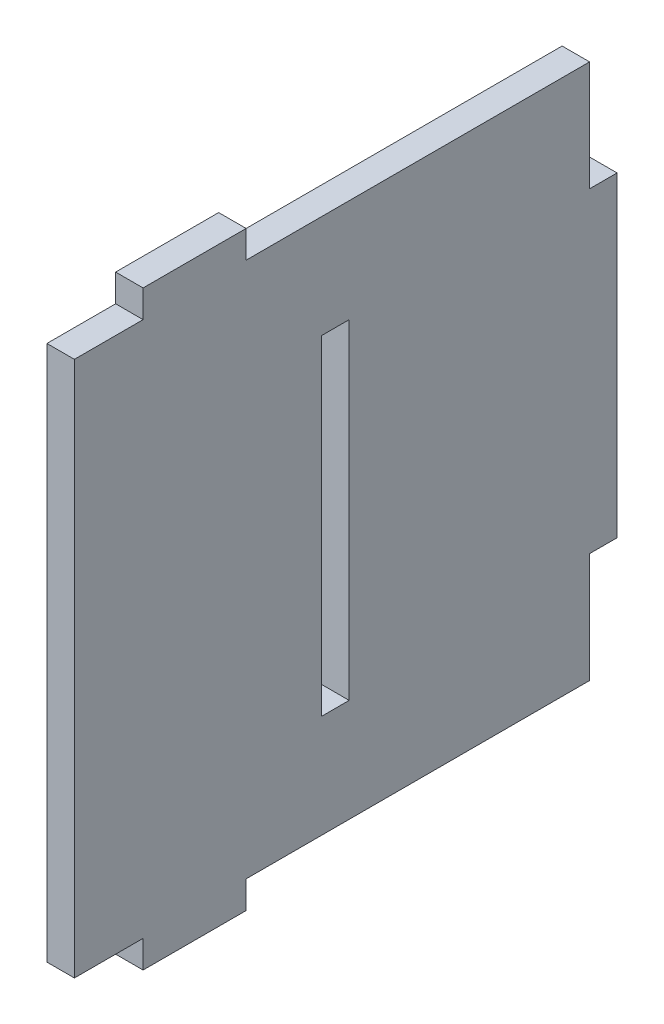
ISO-10303-21;
HEADER;
FILE_DESCRIPTION(('STEP AP214'),'2;1');
FILE_NAME('part.step','',(''),(''),'','','');
FILE_SCHEMA(('AUTOMOTIVE_DESIGN { 1 0 10303 214 1 1 1 1 }'));
ENDSEC;
DATA;
#1=APPLICATION_CONTEXT('core data for automotive mechanical design processes');
#2=APPLICATION_PROTOCOL_DEFINITION('international standard','automotive_design',2000,#1);
#3=PRODUCT_CONTEXT('',#1,'mechanical');
#4=PRODUCT('Part','Part','',(#3));
#5=PRODUCT_RELATED_PRODUCT_CATEGORY('part','',(#4));
#6=PRODUCT_DEFINITION_FORMATION('','',#4);
#7=PRODUCT_DEFINITION_CONTEXT('part definition',#1,'design');
#8=PRODUCT_DEFINITION('design','',#6,#7);
#9=PRODUCT_DEFINITION_SHAPE('','',#8);
#10=(LENGTH_UNIT() NAMED_UNIT(*) SI_UNIT(.MILLI.,.METRE.));
#11=(NAMED_UNIT(*) PLANE_ANGLE_UNIT() SI_UNIT($,.RADIAN.));
#12=(NAMED_UNIT(*) SI_UNIT($,.STERADIAN.) SOLID_ANGLE_UNIT());
#13=UNCERTAINTY_MEASURE_WITH_UNIT(LENGTH_MEASURE(1.E-05),#10,'distance_accuracy_value','');
#14=(GEOMETRIC_REPRESENTATION_CONTEXT(3) GLOBAL_UNCERTAINTY_ASSIGNED_CONTEXT((#13)) GLOBAL_UNIT_ASSIGNED_CONTEXT((#10,
#11,#12)) REPRESENTATION_CONTEXT('',''));
#15=CARTESIAN_POINT('',(0.,0.,0.));
#16=DIRECTION('',(0.,0.,1.));
#17=DIRECTION('',(1.,0.,0.));
#18=AXIS2_PLACEMENT_3D('',#15,#16,#17);
#19=CARTESIAN_POINT('',(4.,0.,0.));
#20=DIRECTION('',(-1.,0.,0.));
#21=DIRECTION('',(0.,0.,1.));
#22=AXIS2_PLACEMENT_3D('',#19,#20,#21);
#23=PLANE('',#22);
#24=DIRECTION('',(0.,-1.,0.));
#25=VECTOR('',#24,1.);
#26=CARTESIAN_POINT('',(4.,0.,0.));
#27=LINE('',#26,#25);
#28=CARTESIAN_POINT('',(4.,78.,0.));
#29=VERTEX_POINT('',#28);
#30=CARTESIAN_POINT('',(4.,0.,0.));
#31=VERTEX_POINT('',#30);
#32=EDGE_CURVE('E205',#29,#31,#27,.T.);
#33=ORIENTED_EDGE('',*,*,#32,.T.);
#34=DIRECTION('',(0.,0.,-1.));
#35=VECTOR('',#34,1.);
#36=CARTESIAN_POINT('',(4.,0.,0.));
#37=LINE('',#36,#35);
#38=CARTESIAN_POINT('',(4.,0.,-10.));
#39=VERTEX_POINT('',#38);
#40=EDGE_CURVE('E208',#31,#39,#37,.T.);
#41=ORIENTED_EDGE('',*,*,#40,.T.);
#42=DIRECTION('',(0.,-1.,0.));
#43=VECTOR('',#42,1.);
#44=CARTESIAN_POINT('',(4.,0.,-10.));
#45=LINE('',#44,#43);
#46=CARTESIAN_POINT('',(4.,-4.,-10.));
#47=VERTEX_POINT('',#46);
#48=EDGE_CURVE('E211',#39,#47,#45,.T.);
#49=ORIENTED_EDGE('',*,*,#48,.T.);
#50=DIRECTION('',(0.,0.,-1.));
#51=VECTOR('',#50,1.);
#52=CARTESIAN_POINT('',(4.,-4.,-10.));
#53=LINE('',#52,#51);
#54=CARTESIAN_POINT('',(4.,-4.,-25.));
#55=VERTEX_POINT('',#54);
#56=EDGE_CURVE('E213',#47,#55,#53,.T.);
#57=ORIENTED_EDGE('',*,*,#56,.T.);
#58=DIRECTION('',(0.,1.,0.));
#59=VECTOR('',#58,1.);
#60=CARTESIAN_POINT('',(4.,-4.,-25.));
#61=LINE('',#60,#59);
#62=CARTESIAN_POINT('',(4.,0.,-25.));
#63=VERTEX_POINT('',#62);
#64=EDGE_CURVE('E215',#55,#63,#61,.T.);
#65=ORIENTED_EDGE('',*,*,#64,.T.);
#66=DIRECTION('',(0.,0.,-1.));
#67=VECTOR('',#66,1.);
#68=CARTESIAN_POINT('',(4.,0.,-25.));
#69=LINE('',#68,#67);
#70=CARTESIAN_POINT('',(4.,0.,-75.));
#71=VERTEX_POINT('',#70);
#72=EDGE_CURVE('E217',#63,#71,#69,.T.);
#73=ORIENTED_EDGE('',*,*,#72,.T.);
#74=DIRECTION('',(0.,1.,0.));
#75=VECTOR('',#74,1.);
#76=CARTESIAN_POINT('',(4.,0.,-75.));
#77=LINE('',#76,#75);
#78=CARTESIAN_POINT('',(4.,16.,-75.));
#79=VERTEX_POINT('',#78);
#80=EDGE_CURVE('E219',#71,#79,#77,.T.);
#81=ORIENTED_EDGE('',*,*,#80,.T.);
#82=DIRECTION('',(0.,0.,-1.));
#83=VECTOR('',#82,1.);
#84=CARTESIAN_POINT('',(4.,16.,-75.));
#85=LINE('',#84,#83);
#86=CARTESIAN_POINT('',(4.,16.,-79.));
#87=VERTEX_POINT('',#86);
#88=EDGE_CURVE('E221',#79,#87,#85,.T.);
#89=ORIENTED_EDGE('',*,*,#88,.T.);
#90=DIRECTION('',(0.,1.,0.));
#91=VECTOR('',#90,1.);
#92=CARTESIAN_POINT('',(4.,62.,-79.));
#93=LINE('',#92,#91);
#94=CARTESIAN_POINT('',(4.,62.,-79.));
#95=VERTEX_POINT('',#94);
#96=EDGE_CURVE('E223',#87,#95,#93,.T.);
#97=ORIENTED_EDGE('',*,*,#96,.T.);
#98=DIRECTION('',(0.,0.,1.));
#99=VECTOR('',#98,1.);
#100=CARTESIAN_POINT('',(4.,62.,-75.));
#101=LINE('',#100,#99);
#102=CARTESIAN_POINT('',(4.,62.,-75.));
#103=VERTEX_POINT('',#102);
#104=EDGE_CURVE('E225',#95,#103,#101,.T.);
#105=ORIENTED_EDGE('',*,*,#104,.T.);
#106=DIRECTION('',(0.,1.,0.));
#107=VECTOR('',#106,1.);
#108=CARTESIAN_POINT('',(4.,62.,-75.));
#109=LINE('',#108,#107);
#110=CARTESIAN_POINT('',(4.,78.,-75.));
#111=VERTEX_POINT('',#110);
#112=EDGE_CURVE('E227',#103,#111,#109,.T.);
#113=ORIENTED_EDGE('',*,*,#112,.T.);
#114=DIRECTION('',(0.,0.,1.));
#115=VECTOR('',#114,1.);
#116=CARTESIAN_POINT('',(4.,78.,-25.));
#117=LINE('',#116,#115);
#118=CARTESIAN_POINT('',(4.,78.,-25.));
#119=VERTEX_POINT('',#118);
#120=EDGE_CURVE('E229',#111,#119,#117,.T.);
#121=ORIENTED_EDGE('',*,*,#120,.T.);
#122=DIRECTION('',(0.,1.,0.));
#123=VECTOR('',#122,1.);
#124=CARTESIAN_POINT('',(4.,82.,-25.));
#125=LINE('',#124,#123);
#126=CARTESIAN_POINT('',(4.,82.,-25.));
#127=VERTEX_POINT('',#126);
#128=EDGE_CURVE('E231',#119,#127,#125,.T.);
#129=ORIENTED_EDGE('',*,*,#128,.T.);
#130=DIRECTION('',(0.,0.,1.));
#131=VECTOR('',#130,1.);
#132=CARTESIAN_POINT('',(4.,82.,-10.));
#133=LINE('',#132,#131);
#134=CARTESIAN_POINT('',(4.,82.,-10.));
#135=VERTEX_POINT('',#134);
#136=EDGE_CURVE('E233',#127,#135,#133,.T.);
#137=ORIENTED_EDGE('',*,*,#136,.T.);
#138=DIRECTION('',(0.,-1.,0.));
#139=VECTOR('',#138,1.);
#140=CARTESIAN_POINT('',(4.,78.,-10.));
#141=LINE('',#140,#139);
#142=CARTESIAN_POINT('',(4.,78.,-10.));
#143=VERTEX_POINT('',#142);
#144=EDGE_CURVE('E235',#135,#143,#141,.T.);
#145=ORIENTED_EDGE('',*,*,#144,.T.);
#146=DIRECTION('',(0.,0.,1.));
#147=VECTOR('',#146,1.);
#148=CARTESIAN_POINT('',(4.,78.,0.));
#149=LINE('',#148,#147);
#150=EDGE_CURVE('E237',#143,#29,#149,.T.);
#151=ORIENTED_EDGE('',*,*,#150,.T.);
#152=EDGE_LOOP('',(#33,#41,#49,#57,#65,#73,#81,#89,#97,#105,#113,#121,#129,#137,#145,#151));
#153=FACE_BOUND('',#152,.T.);
#154=DIRECTION('',(0.,-1.,0.));
#155=VECTOR('',#154,1.);
#156=CARTESIAN_POINT('',(4.,15.,-36.));
#157=LINE('',#156,#155);
#158=CARTESIAN_POINT('',(4.,63.,-36.));
#159=VERTEX_POINT('',#158);
#160=CARTESIAN_POINT('',(4.,15.,-36.));
#161=VERTEX_POINT('',#160);
#162=EDGE_CURVE('E169',#159,#161,#157,.T.);
#163=ORIENTED_EDGE('',*,*,#162,.F.);
#164=DIRECTION('',(0.,0.,1.));
#165=VECTOR('',#164,1.);
#166=CARTESIAN_POINT('',(4.,63.,-36.));
#167=LINE('',#166,#165);
#168=CARTESIAN_POINT('',(4.,63.,-40.));
#169=VERTEX_POINT('',#168);
#170=EDGE_CURVE('E191',#169,#159,#167,.T.);
#171=ORIENTED_EDGE('',*,*,#170,.F.);
#172=DIRECTION('',(0.,1.,0.));
#173=VECTOR('',#172,1.);
#174=CARTESIAN_POINT('',(4.,15.,-40.));
#175=LINE('',#174,#173);
#176=CARTESIAN_POINT('',(4.,15.,-40.));
#177=VERTEX_POINT('',#176);
#178=EDGE_CURVE('E189',#177,#169,#175,.T.);
#179=ORIENTED_EDGE('',*,*,#178,.F.);
#180=DIRECTION('',(0.,0.,-1.));
#181=VECTOR('',#180,1.);
#182=CARTESIAN_POINT('',(4.,15.,-36.));
#183=LINE('',#182,#181);
#184=EDGE_CURVE('E177',#161,#177,#183,.T.);
#185=ORIENTED_EDGE('',*,*,#184,.F.);
#186=EDGE_LOOP('',(#163,#171,#179,#185));
#187=FACE_BOUND('',#186,.T.);
#188=ADVANCED_FACE('F32',(#153,#187),#23,.F.);
#189=CARTESIAN_POINT('',(0.,0.,0.));
#190=DIRECTION('',(-1.,0.,0.));
#191=DIRECTION('',(0.,0.,1.));
#192=AXIS2_PLACEMENT_3D('',#189,#190,#191);
#193=PLANE('',#192);
#194=DIRECTION('',(0.,-1.,0.));
#195=VECTOR('',#194,1.);
#196=CARTESIAN_POINT('',(0.,0.,0.));
#197=LINE('',#196,#195);
#198=CARTESIAN_POINT('',(0.,78.,0.));
#199=VERTEX_POINT('',#198);
#200=CARTESIAN_POINT('',(0.,0.,0.));
#201=VERTEX_POINT('',#200);
#202=EDGE_CURVE('E185',#199,#201,#197,.T.);
#203=ORIENTED_EDGE('',*,*,#202,.F.);
#204=DIRECTION('',(0.,0.,1.));
#205=VECTOR('',#204,1.);
#206=CARTESIAN_POINT('',(0.,78.,0.));
#207=LINE('',#206,#205);
#208=CARTESIAN_POINT('',(0.,78.,-10.));
#209=VERTEX_POINT('',#208);
#210=EDGE_CURVE('E209',#209,#199,#207,.T.);
#211=ORIENTED_EDGE('',*,*,#210,.F.);
#212=DIRECTION('',(0.,-1.,0.));
#213=VECTOR('',#212,1.);
#214=CARTESIAN_POINT('',(0.,78.,-10.));
#215=LINE('',#214,#213);
#216=CARTESIAN_POINT('',(0.,82.,-10.));
#217=VERTEX_POINT('',#216);
#218=EDGE_CURVE('E268',#217,#209,#215,.T.);
#219=ORIENTED_EDGE('',*,*,#218,.F.);
#220=DIRECTION('',(0.,0.,1.));
#221=VECTOR('',#220,1.);
#222=CARTESIAN_POINT('',(0.,82.,-10.));
#223=LINE('',#222,#221);
#224=CARTESIAN_POINT('',(0.,82.,-25.));
#225=VERTEX_POINT('',#224);
#226=EDGE_CURVE('E266',#225,#217,#223,.T.);
#227=ORIENTED_EDGE('',*,*,#226,.F.);
#228=DIRECTION('',(0.,1.,0.));
#229=VECTOR('',#228,1.);
#230=CARTESIAN_POINT('',(0.,82.,-25.));
#231=LINE('',#230,#229);
#232=CARTESIAN_POINT('',(0.,78.,-25.));
#233=VERTEX_POINT('',#232);
#234=EDGE_CURVE('E264',#233,#225,#231,.T.);
#235=ORIENTED_EDGE('',*,*,#234,.F.);
#236=DIRECTION('',(0.,0.,1.));
#237=VECTOR('',#236,1.);
#238=CARTESIAN_POINT('',(0.,78.,-25.));
#239=LINE('',#238,#237);
#240=CARTESIAN_POINT('',(0.,78.,-75.));
#241=VERTEX_POINT('',#240);
#242=EDGE_CURVE('E262',#241,#233,#239,.T.);
#243=ORIENTED_EDGE('',*,*,#242,.F.);
#244=DIRECTION('',(0.,1.,0.));
#245=VECTOR('',#244,1.);
#246=CARTESIAN_POINT('',(0.,62.,-75.));
#247=LINE('',#246,#245);
#248=CARTESIAN_POINT('',(0.,62.,-75.));
#249=VERTEX_POINT('',#248);
#250=EDGE_CURVE('E260',#249,#241,#247,.T.);
#251=ORIENTED_EDGE('',*,*,#250,.F.);
#252=DIRECTION('',(0.,0.,1.));
#253=VECTOR('',#252,1.);
#254=CARTESIAN_POINT('',(0.,62.,-75.));
#255=LINE('',#254,#253);
#256=CARTESIAN_POINT('',(0.,62.,-79.));
#257=VERTEX_POINT('',#256);
#258=EDGE_CURVE('E258',#257,#249,#255,.T.);
#259=ORIENTED_EDGE('',*,*,#258,.F.);
#260=DIRECTION('',(0.,1.,0.));
#261=VECTOR('',#260,1.);
#262=CARTESIAN_POINT('',(0.,62.,-79.));
#263=LINE('',#262,#261);
#264=CARTESIAN_POINT('',(0.,16.,-79.));
#265=VERTEX_POINT('',#264);
#266=EDGE_CURVE('E256',#265,#257,#263,.T.);
#267=ORIENTED_EDGE('',*,*,#266,.F.);
#268=DIRECTION('',(0.,0.,-1.));
#269=VECTOR('',#268,1.);
#270=CARTESIAN_POINT('',(0.,16.,-75.));
#271=LINE('',#270,#269);
#272=CARTESIAN_POINT('',(0.,16.,-75.));
#273=VERTEX_POINT('',#272);
#274=EDGE_CURVE('E254',#273,#265,#271,.T.);
#275=ORIENTED_EDGE('',*,*,#274,.F.);
#276=DIRECTION('',(0.,1.,0.));
#277=VECTOR('',#276,1.);
#278=CARTESIAN_POINT('',(0.,0.,-75.));
#279=LINE('',#278,#277);
#280=CARTESIAN_POINT('',(0.,0.,-75.));
#281=VERTEX_POINT('',#280);
#282=EDGE_CURVE('E252',#281,#273,#279,.T.);
#283=ORIENTED_EDGE('',*,*,#282,.F.);
#284=DIRECTION('',(0.,0.,-1.));
#285=VECTOR('',#284,1.);
#286=CARTESIAN_POINT('',(0.,0.,-25.));
#287=LINE('',#286,#285);
#288=CARTESIAN_POINT('',(0.,0.,-25.));
#289=VERTEX_POINT('',#288);
#290=EDGE_CURVE('E250',#289,#281,#287,.T.);
#291=ORIENTED_EDGE('',*,*,#290,.F.);
#292=DIRECTION('',(0.,1.,0.));
#293=VECTOR('',#292,1.);
#294=CARTESIAN_POINT('',(0.,-4.,-25.));
#295=LINE('',#294,#293);
#296=CARTESIAN_POINT('',(0.,-4.,-25.));
#297=VERTEX_POINT('',#296);
#298=EDGE_CURVE('E248',#297,#289,#295,.T.);
#299=ORIENTED_EDGE('',*,*,#298,.F.);
#300=DIRECTION('',(0.,0.,-1.));
#301=VECTOR('',#300,1.);
#302=CARTESIAN_POINT('',(0.,-4.,-10.));
#303=LINE('',#302,#301);
#304=CARTESIAN_POINT('',(0.,-4.,-10.));
#305=VERTEX_POINT('',#304);
#306=EDGE_CURVE('E246',#305,#297,#303,.T.);
#307=ORIENTED_EDGE('',*,*,#306,.F.);
#308=DIRECTION('',(0.,-1.,0.));
#309=VECTOR('',#308,1.);
#310=CARTESIAN_POINT('',(0.,0.,-10.));
#311=LINE('',#310,#309);
#312=CARTESIAN_POINT('',(0.,0.,-10.));
#313=VERTEX_POINT('',#312);
#314=EDGE_CURVE('E244',#313,#305,#311,.T.);
#315=ORIENTED_EDGE('',*,*,#314,.F.);
#316=DIRECTION('',(0.,0.,-1.));
#317=VECTOR('',#316,1.);
#318=CARTESIAN_POINT('',(0.,0.,0.));
#319=LINE('',#318,#317);
#320=EDGE_CURVE('E242',#201,#313,#319,.T.);
#321=ORIENTED_EDGE('',*,*,#320,.F.);
#322=EDGE_LOOP('',(#203,#211,#219,#227,#235,#243,#251,#259,#267,#275,#283,#291,#299,#307,#315,#321));
#323=FACE_BOUND('',#322,.T.);
#324=DIRECTION('',(0.,0.,1.));
#325=VECTOR('',#324,1.);
#326=CARTESIAN_POINT('',(0.,63.,-36.));
#327=LINE('',#326,#325);
#328=CARTESIAN_POINT('',(0.,63.,-40.));
#329=VERTEX_POINT('',#328);
#330=CARTESIAN_POINT('',(0.,63.,-36.));
#331=VERTEX_POINT('',#330);
#332=EDGE_CURVE('E178',#329,#331,#327,.T.);
#333=ORIENTED_EDGE('',*,*,#332,.T.);
#334=DIRECTION('',(0.,-1.,0.));
#335=VECTOR('',#334,1.);
#336=CARTESIAN_POINT('',(0.,15.,-36.));
#337=LINE('',#336,#335);
#338=CARTESIAN_POINT('',(0.,15.,-36.));
#339=VERTEX_POINT('',#338);
#340=EDGE_CURVE('E55',#331,#339,#337,.T.);
#341=ORIENTED_EDGE('',*,*,#340,.T.);
#342=DIRECTION('',(0.,0.,-1.));
#343=VECTOR('',#342,1.);
#344=CARTESIAN_POINT('',(0.,15.,-36.));
#345=LINE('',#344,#343);
#346=CARTESIAN_POINT('',(0.,15.,-40.));
#347=VERTEX_POINT('',#346);
#348=EDGE_CURVE('E184',#339,#347,#345,.T.);
#349=ORIENTED_EDGE('',*,*,#348,.T.);
#350=DIRECTION('',(0.,1.,0.));
#351=VECTOR('',#350,1.);
#352=CARTESIAN_POINT('',(0.,15.,-40.));
#353=LINE('',#352,#351);
#354=EDGE_CURVE('E197',#347,#329,#353,.T.);
#355=ORIENTED_EDGE('',*,*,#354,.T.);
#356=EDGE_LOOP('',(#333,#341,#349,#355));
#357=FACE_BOUND('',#356,.T.);
#358=ADVANCED_FACE('F322',(#323,#357),#193,.T.);
#359=CARTESIAN_POINT('',(4.,0.,0.));
#360=DIRECTION('',(0.,0.,-1.));
#361=DIRECTION('',(-1.,0.,0.));
#362=AXIS2_PLACEMENT_3D('',#359,#360,#361);
#363=PLANE('',#362);
#364=ORIENTED_EDGE('',*,*,#202,.T.);
#365=DIRECTION('',(-1.,0.,0.));
#366=VECTOR('',#365,1.);
#367=CARTESIAN_POINT('',(4.,0.,0.));
#368=LINE('',#367,#366);
#369=EDGE_CURVE('E11',#31,#201,#368,.T.);
#370=ORIENTED_EDGE('',*,*,#369,.F.);
#371=ORIENTED_EDGE('',*,*,#32,.F.);
#372=DIRECTION('',(-1.,0.,0.));
#373=VECTOR('',#372,1.);
#374=CARTESIAN_POINT('',(4.,78.,0.));
#375=LINE('',#374,#373);
#376=EDGE_CURVE('E239',#29,#199,#375,.T.);
#377=ORIENTED_EDGE('',*,*,#376,.T.);
#378=EDGE_LOOP('',(#364,#370,#371,#377));
#379=FACE_BOUND('',#378,.T.);
#380=ADVANCED_FACE('F34',(#379),#363,.F.);
#381=CARTESIAN_POINT('',(4.,0.,0.));
#382=DIRECTION('',(0.,1.,0.));
#383=DIRECTION('',(0.,0.,1.));
#384=AXIS2_PLACEMENT_3D('',#381,#382,#383);
#385=PLANE('',#384);
#386=ORIENTED_EDGE('',*,*,#320,.T.);
#387=DIRECTION('',(-1.,0.,0.));
#388=VECTOR('',#387,1.);
#389=CARTESIAN_POINT('',(4.,0.,-10.));
#390=LINE('',#389,#388);
#391=EDGE_CURVE('E40',#39,#313,#390,.T.);
#392=ORIENTED_EDGE('',*,*,#391,.F.);
#393=ORIENTED_EDGE('',*,*,#40,.F.);
#394=ORIENTED_EDGE('',*,*,#369,.T.);
#395=EDGE_LOOP('',(#386,#392,#393,#394));
#396=FACE_BOUND('',#395,.T.);
#397=ADVANCED_FACE('F339',(#396),#385,.F.);
#398=CARTESIAN_POINT('',(4.,0.,-10.));
#399=DIRECTION('',(0.,0.,-1.));
#400=DIRECTION('',(0.,1.,0.));
#401=AXIS2_PLACEMENT_3D('',#398,#399,#400);
#402=PLANE('',#401);
#403=ORIENTED_EDGE('',*,*,#314,.T.);
#404=DIRECTION('',(-1.,0.,0.));
#405=VECTOR('',#404,1.);
#406=CARTESIAN_POINT('',(4.,-4.,-10.));
#407=LINE('',#406,#405);
#408=EDGE_CURVE('E309',#47,#305,#407,.T.);
#409=ORIENTED_EDGE('',*,*,#408,.F.);
#410=ORIENTED_EDGE('',*,*,#48,.F.);
#411=ORIENTED_EDGE('',*,*,#391,.T.);
#412=EDGE_LOOP('',(#403,#409,#410,#411));
#413=FACE_BOUND('',#412,.T.);
#414=ADVANCED_FACE('F316',(#413),#402,.F.);
#415=CARTESIAN_POINT('',(4.,-4.,-10.));
#416=DIRECTION('',(0.,1.,0.));
#417=DIRECTION('',(0.,0.,1.));
#418=AXIS2_PLACEMENT_3D('',#415,#416,#417);
#419=PLANE('',#418);
#420=ORIENTED_EDGE('',*,*,#306,.T.);
#421=DIRECTION('',(-1.,0.,0.));
#422=VECTOR('',#421,1.);
#423=CARTESIAN_POINT('',(4.,-4.,-25.));
#424=LINE('',#423,#422);
#425=EDGE_CURVE('E306',#55,#297,#424,.T.);
#426=ORIENTED_EDGE('',*,*,#425,.F.);
#427=ORIENTED_EDGE('',*,*,#56,.F.);
#428=ORIENTED_EDGE('',*,*,#408,.T.);
#429=EDGE_LOOP('',(#420,#426,#427,#428));
#430=FACE_BOUND('',#429,.T.);
#431=ADVANCED_FACE('F328',(#430),#419,.F.);
#432=CARTESIAN_POINT('',(4.,-4.,-25.));
#433=DIRECTION('',(0.,0.,1.));
#434=DIRECTION('',(0.,-1.,0.));
#435=AXIS2_PLACEMENT_3D('',#432,#433,#434);
#436=PLANE('',#435);
#437=ORIENTED_EDGE('',*,*,#298,.T.);
#438=DIRECTION('',(-1.,0.,0.));
#439=VECTOR('',#438,1.);
#440=CARTESIAN_POINT('',(4.,0.,-25.));
#441=LINE('',#440,#439);
#442=EDGE_CURVE('E303',#63,#289,#441,.T.);
#443=ORIENTED_EDGE('',*,*,#442,.F.);
#444=ORIENTED_EDGE('',*,*,#64,.F.);
#445=ORIENTED_EDGE('',*,*,#425,.T.);
#446=EDGE_LOOP('',(#437,#443,#444,#445));
#447=FACE_BOUND('',#446,.T.);
#448=ADVANCED_FACE('F332',(#447),#436,.F.);
#449=CARTESIAN_POINT('',(4.,0.,-25.));
#450=DIRECTION('',(0.,1.,0.));
#451=DIRECTION('',(0.,0.,1.));
#452=AXIS2_PLACEMENT_3D('',#449,#450,#451);
#453=PLANE('',#452);
#454=ORIENTED_EDGE('',*,*,#290,.T.);
#455=DIRECTION('',(-1.,0.,0.));
#456=VECTOR('',#455,1.);
#457=CARTESIAN_POINT('',(4.,0.,-75.));
#458=LINE('',#457,#456);
#459=EDGE_CURVE('E300',#71,#281,#458,.T.);
#460=ORIENTED_EDGE('',*,*,#459,.F.);
#461=ORIENTED_EDGE('',*,*,#72,.F.);
#462=ORIENTED_EDGE('',*,*,#442,.T.);
#463=EDGE_LOOP('',(#454,#460,#461,#462));
#464=FACE_BOUND('',#463,.T.);
#465=ADVANCED_FACE('F392',(#464),#453,.F.);
#466=CARTESIAN_POINT('',(4.,0.,-75.));
#467=DIRECTION('',(0.,0.,1.));
#468=DIRECTION('',(1.,0.,0.));
#469=AXIS2_PLACEMENT_3D('',#466,#467,#468);
#470=PLANE('',#469);
#471=ORIENTED_EDGE('',*,*,#282,.T.);
#472=DIRECTION('',(-1.,0.,0.));
#473=VECTOR('',#472,1.);
#474=CARTESIAN_POINT('',(4.,16.,-75.));
#475=LINE('',#474,#473);
#476=EDGE_CURVE('E297',#79,#273,#475,.T.);
#477=ORIENTED_EDGE('',*,*,#476,.F.);
#478=ORIENTED_EDGE('',*,*,#80,.F.);
#479=ORIENTED_EDGE('',*,*,#459,.T.);
#480=EDGE_LOOP('',(#471,#477,#478,#479));
#481=FACE_BOUND('',#480,.T.);
#482=ADVANCED_FACE('F389',(#481),#470,.F.);
#483=CARTESIAN_POINT('',(4.,16.,-75.));
#484=DIRECTION('',(0.,1.,0.));
#485=DIRECTION('',(0.,0.,1.));
#486=AXIS2_PLACEMENT_3D('',#483,#484,#485);
#487=PLANE('',#486);
#488=ORIENTED_EDGE('',*,*,#274,.T.);
#489=DIRECTION('',(-1.,0.,0.));
#490=VECTOR('',#489,1.);
#491=CARTESIAN_POINT('',(4.,16.,-79.));
#492=LINE('',#491,#490);
#493=EDGE_CURVE('E294',#87,#265,#492,.T.);
#494=ORIENTED_EDGE('',*,*,#493,.F.);
#495=ORIENTED_EDGE('',*,*,#88,.F.);
#496=ORIENTED_EDGE('',*,*,#476,.T.);
#497=EDGE_LOOP('',(#488,#494,#495,#496));
#498=FACE_BOUND('',#497,.T.);
#499=ADVANCED_FACE('F385',(#498),#487,.F.);
#500=CARTESIAN_POINT('',(4.,62.,-79.));
#501=DIRECTION('',(0.,0.,1.));
#502=DIRECTION('',(1.,0.,0.));
#503=AXIS2_PLACEMENT_3D('',#500,#501,#502);
#504=PLANE('',#503);
#505=ORIENTED_EDGE('',*,*,#266,.T.);
#506=DIRECTION('',(-1.,0.,0.));
#507=VECTOR('',#506,1.);
#508=CARTESIAN_POINT('',(4.,62.,-79.));
#509=LINE('',#508,#507);
#510=EDGE_CURVE('E291',#95,#257,#509,.T.);
#511=ORIENTED_EDGE('',*,*,#510,.F.);
#512=ORIENTED_EDGE('',*,*,#96,.F.);
#513=ORIENTED_EDGE('',*,*,#493,.T.);
#514=EDGE_LOOP('',(#505,#511,#512,#513));
#515=FACE_BOUND('',#514,.T.);
#516=ADVANCED_FACE('F381',(#515),#504,.F.);
#517=CARTESIAN_POINT('',(4.,62.,-75.));
#518=DIRECTION('',(0.,-1.,0.));
#519=DIRECTION('',(0.,0.,-1.));
#520=AXIS2_PLACEMENT_3D('',#517,#518,#519);
#521=PLANE('',#520);
#522=ORIENTED_EDGE('',*,*,#258,.T.);
#523=DIRECTION('',(-1.,0.,0.));
#524=VECTOR('',#523,1.);
#525=CARTESIAN_POINT('',(4.,62.,-75.));
#526=LINE('',#525,#524);
#527=EDGE_CURVE('E288',#103,#249,#526,.T.);
#528=ORIENTED_EDGE('',*,*,#527,.F.);
#529=ORIENTED_EDGE('',*,*,#104,.F.);
#530=ORIENTED_EDGE('',*,*,#510,.T.);
#531=EDGE_LOOP('',(#522,#528,#529,#530));
#532=FACE_BOUND('',#531,.T.);
#533=ADVANCED_FACE('F376',(#532),#521,.F.);
#534=CARTESIAN_POINT('',(4.,62.,-75.));
#535=DIRECTION('',(0.,0.,1.));
#536=DIRECTION('',(0.,-1.,0.));
#537=AXIS2_PLACEMENT_3D('',#534,#535,#536);
#538=PLANE('',#537);
#539=ORIENTED_EDGE('',*,*,#250,.T.);
#540=DIRECTION('',(-1.,0.,0.));
#541=VECTOR('',#540,1.);
#542=CARTESIAN_POINT('',(4.,78.,-75.));
#543=LINE('',#542,#541);
#544=EDGE_CURVE('E285',#111,#241,#543,.T.);
#545=ORIENTED_EDGE('',*,*,#544,.F.);
#546=ORIENTED_EDGE('',*,*,#112,.F.);
#547=ORIENTED_EDGE('',*,*,#527,.T.);
#548=EDGE_LOOP('',(#539,#545,#546,#547));
#549=FACE_BOUND('',#548,.T.);
#550=ADVANCED_FACE('F370',(#549),#538,.F.);
#551=CARTESIAN_POINT('',(4.,78.,-25.));
#552=DIRECTION('',(0.,-1.,0.));
#553=DIRECTION('',(0.,0.,-1.));
#554=AXIS2_PLACEMENT_3D('',#551,#552,#553);
#555=PLANE('',#554);
#556=ORIENTED_EDGE('',*,*,#242,.T.);
#557=DIRECTION('',(-1.,0.,0.));
#558=VECTOR('',#557,1.);
#559=CARTESIAN_POINT('',(4.,78.,-25.));
#560=LINE('',#559,#558);
#561=EDGE_CURVE('E282',#119,#233,#560,.T.);
#562=ORIENTED_EDGE('',*,*,#561,.F.);
#563=ORIENTED_EDGE('',*,*,#120,.F.);
#564=ORIENTED_EDGE('',*,*,#544,.T.);
#565=EDGE_LOOP('',(#556,#562,#563,#564));
#566=FACE_BOUND('',#565,.T.);
#567=ADVANCED_FACE('F366',(#566),#555,.F.);
#568=CARTESIAN_POINT('',(4.,82.,-25.));
#569=DIRECTION('',(0.,0.,1.));
#570=DIRECTION('',(0.,-1.,0.));
#571=AXIS2_PLACEMENT_3D('',#568,#569,#570);
#572=PLANE('',#571);
#573=ORIENTED_EDGE('',*,*,#234,.T.);
#574=DIRECTION('',(-1.,0.,0.));
#575=VECTOR('',#574,1.);
#576=CARTESIAN_POINT('',(4.,82.,-25.));
#577=LINE('',#576,#575);
#578=EDGE_CURVE('E279',#127,#225,#577,.T.);
#579=ORIENTED_EDGE('',*,*,#578,.F.);
#580=ORIENTED_EDGE('',*,*,#128,.F.);
#581=ORIENTED_EDGE('',*,*,#561,.T.);
#582=EDGE_LOOP('',(#573,#579,#580,#581));
#583=FACE_BOUND('',#582,.T.);
#584=ADVANCED_FACE('F361',(#583),#572,.F.);
#585=CARTESIAN_POINT('',(4.,82.,-10.));
#586=DIRECTION('',(0.,-1.,0.));
#587=DIRECTION('',(0.,0.,-1.));
#588=AXIS2_PLACEMENT_3D('',#585,#586,#587);
#589=PLANE('',#588);
#590=ORIENTED_EDGE('',*,*,#226,.T.);
#591=DIRECTION('',(-1.,0.,0.));
#592=VECTOR('',#591,1.);
#593=CARTESIAN_POINT('',(4.,82.,-10.));
#594=LINE('',#593,#592);
#595=EDGE_CURVE('E276',#135,#217,#594,.T.);
#596=ORIENTED_EDGE('',*,*,#595,.F.);
#597=ORIENTED_EDGE('',*,*,#136,.F.);
#598=ORIENTED_EDGE('',*,*,#578,.T.);
#599=EDGE_LOOP('',(#590,#596,#597,#598));
#600=FACE_BOUND('',#599,.T.);
#601=ADVANCED_FACE('F355',(#600),#589,.F.);
#602=CARTESIAN_POINT('',(4.,78.,-10.));
#603=DIRECTION('',(0.,0.,-1.));
#604=DIRECTION('',(0.,1.,0.));
#605=AXIS2_PLACEMENT_3D('',#602,#603,#604);
#606=PLANE('',#605);
#607=ORIENTED_EDGE('',*,*,#218,.T.);
#608=DIRECTION('',(-1.,0.,0.));
#609=VECTOR('',#608,1.);
#610=CARTESIAN_POINT('',(4.,78.,-10.));
#611=LINE('',#610,#609);
#612=EDGE_CURVE('E273',#143,#209,#611,.T.);
#613=ORIENTED_EDGE('',*,*,#612,.F.);
#614=ORIENTED_EDGE('',*,*,#144,.F.);
#615=ORIENTED_EDGE('',*,*,#595,.T.);
#616=EDGE_LOOP('',(#607,#613,#614,#615));
#617=FACE_BOUND('',#616,.T.);
#618=ADVANCED_FACE('F351',(#617),#606,.F.);
#619=CARTESIAN_POINT('',(4.,78.,0.));
#620=DIRECTION('',(0.,-1.,0.));
#621=DIRECTION('',(0.,0.,-1.));
#622=AXIS2_PLACEMENT_3D('',#619,#620,#621);
#623=PLANE('',#622);
#624=ORIENTED_EDGE('',*,*,#210,.T.);
#625=ORIENTED_EDGE('',*,*,#376,.F.);
#626=ORIENTED_EDGE('',*,*,#150,.F.);
#627=ORIENTED_EDGE('',*,*,#612,.T.);
#628=EDGE_LOOP('',(#624,#625,#626,#627));
#629=FACE_BOUND('',#628,.T.);
#630=ADVANCED_FACE('F346',(#629),#623,.F.);
#631=CARTESIAN_POINT('',(4.,15.,-36.));
#632=DIRECTION('',(0.,0.,-1.));
#633=DIRECTION('',(-1.,0.,0.));
#634=AXIS2_PLACEMENT_3D('',#631,#632,#633);
#635=PLANE('',#634);
#636=ORIENTED_EDGE('',*,*,#340,.F.);
#637=DIRECTION('',(-1.,0.,0.));
#638=VECTOR('',#637,1.);
#639=CARTESIAN_POINT('',(4.,63.,-36.));
#640=LINE('',#639,#638);
#641=EDGE_CURVE('E173',#159,#331,#640,.T.);
#642=ORIENTED_EDGE('',*,*,#641,.F.);
#643=ORIENTED_EDGE('',*,*,#162,.T.);
#644=DIRECTION('',(-1.,0.,0.));
#645=VECTOR('',#644,1.);
#646=CARTESIAN_POINT('',(4.,15.,-36.));
#647=LINE('',#646,#645);
#648=EDGE_CURVE('E172',#161,#339,#647,.T.);
#649=ORIENTED_EDGE('',*,*,#648,.T.);
#650=EDGE_LOOP('',(#636,#642,#643,#649));
#651=FACE_BOUND('',#650,.T.);
#652=ADVANCED_FACE('F171',(#651),#635,.T.);
#653=CARTESIAN_POINT('',(4.,15.,-36.));
#654=DIRECTION('',(0.,1.,0.));
#655=DIRECTION('',(0.,0.,1.));
#656=AXIS2_PLACEMENT_3D('',#653,#654,#655);
#657=PLANE('',#656);
#658=ORIENTED_EDGE('',*,*,#348,.F.);
#659=ORIENTED_EDGE('',*,*,#648,.F.);
#660=ORIENTED_EDGE('',*,*,#184,.T.);
#661=DIRECTION('',(-1.,0.,0.));
#662=VECTOR('',#661,1.);
#663=CARTESIAN_POINT('',(4.,15.,-40.));
#664=LINE('',#663,#662);
#665=EDGE_CURVE('E186',#177,#347,#664,.T.);
#666=ORIENTED_EDGE('',*,*,#665,.T.);
#667=EDGE_LOOP('',(#658,#659,#660,#666));
#668=FACE_BOUND('',#667,.T.);
#669=ADVANCED_FACE('F181',(#668),#657,.T.);
#670=CARTESIAN_POINT('',(4.,15.,-40.));
#671=DIRECTION('',(0.,0.,1.));
#672=DIRECTION('',(1.,0.,0.));
#673=AXIS2_PLACEMENT_3D('',#670,#671,#672);
#674=PLANE('',#673);
#675=ORIENTED_EDGE('',*,*,#354,.F.);
#676=ORIENTED_EDGE('',*,*,#665,.F.);
#677=ORIENTED_EDGE('',*,*,#178,.T.);
#678=DIRECTION('',(-1.,0.,0.));
#679=VECTOR('',#678,1.);
#680=CARTESIAN_POINT('',(4.,63.,-40.));
#681=LINE('',#680,#679);
#682=EDGE_CURVE('E47',#169,#329,#681,.T.);
#683=ORIENTED_EDGE('',*,*,#682,.T.);
#684=EDGE_LOOP('',(#675,#676,#677,#683));
#685=FACE_BOUND('',#684,.T.);
#686=ADVANCED_FACE('F474',(#685),#674,.T.);
#687=CARTESIAN_POINT('',(4.,63.,-36.));
#688=DIRECTION('',(0.,-1.,0.));
#689=DIRECTION('',(0.,0.,-1.));
#690=AXIS2_PLACEMENT_3D('',#687,#688,#689);
#691=PLANE('',#690);
#692=ORIENTED_EDGE('',*,*,#332,.F.);
#693=ORIENTED_EDGE('',*,*,#682,.F.);
#694=ORIENTED_EDGE('',*,*,#170,.T.);
#695=ORIENTED_EDGE('',*,*,#641,.T.);
#696=EDGE_LOOP('',(#692,#693,#694,#695));
#697=FACE_BOUND('',#696,.T.);
#698=ADVANCED_FACE('F480',(#697),#691,.T.);
#699=CLOSED_SHELL('',(#188,#358,#380,#397,#414,#431,#448,#465,#482,#499,#516,#533,#550,#567,
#584,#601,#618,#630,#652,#669,#686,#698));
#700=MANIFOLD_SOLID_BREP('B2',#699);
#701=ADVANCED_BREP_SHAPE_REPRESENTATION('',(#18,#700),#14);
#702=SHAPE_DEFINITION_REPRESENTATION(#9,#701);
ENDSEC;
END-ISO-10303-21;
